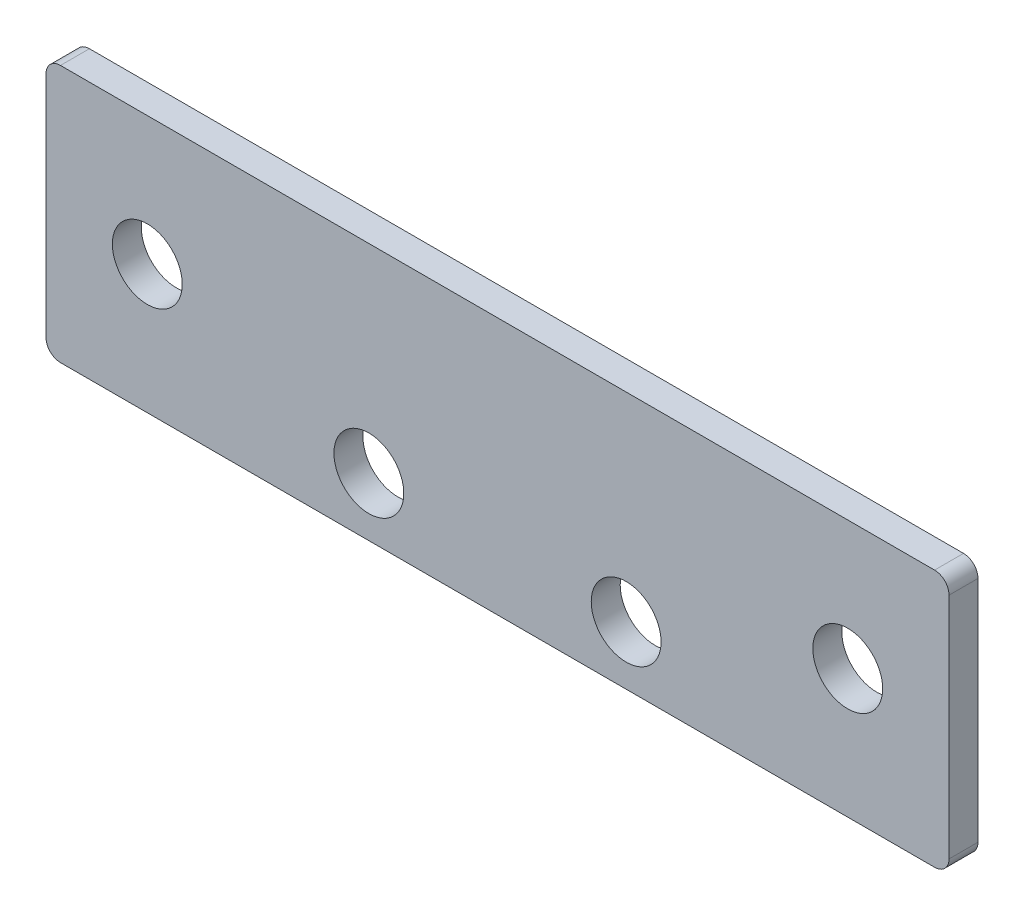
ISO-10303-21;
HEADER;
FILE_DESCRIPTION(('STEP AP214'),'2;1');
FILE_NAME('part.step','',(''),(''),'','','');
FILE_SCHEMA(('AUTOMOTIVE_DESIGN { 1 0 10303 214 1 1 1 1 }'));
ENDSEC;
DATA;
#1=APPLICATION_CONTEXT('core data for automotive mechanical design processes');
#2=APPLICATION_PROTOCOL_DEFINITION('international standard','automotive_design',2000,#1);
#3=PRODUCT_CONTEXT('',#1,'mechanical');
#4=PRODUCT('Part','Part','',(#3));
#5=PRODUCT_RELATED_PRODUCT_CATEGORY('part','',(#4));
#6=PRODUCT_DEFINITION_FORMATION('','',#4);
#7=PRODUCT_DEFINITION_CONTEXT('part definition',#1,'design');
#8=PRODUCT_DEFINITION('design','',#6,#7);
#9=PRODUCT_DEFINITION_SHAPE('','',#8);
#10=(LENGTH_UNIT() NAMED_UNIT(*) SI_UNIT(.MILLI.,.METRE.));
#11=(NAMED_UNIT(*) PLANE_ANGLE_UNIT() SI_UNIT($,.RADIAN.));
#12=(NAMED_UNIT(*) SI_UNIT($,.STERADIAN.) SOLID_ANGLE_UNIT());
#13=UNCERTAINTY_MEASURE_WITH_UNIT(LENGTH_MEASURE(1.E-05),#10,'distance_accuracy_value','');
#14=(GEOMETRIC_REPRESENTATION_CONTEXT(3) GLOBAL_UNCERTAINTY_ASSIGNED_CONTEXT((#13)) GLOBAL_UNIT_ASSIGNED_CONTEXT((#10,
#11,#12)) REPRESENTATION_CONTEXT('',''));
#15=CARTESIAN_POINT('',(0.,0.,0.));
#16=DIRECTION('',(0.,0.,1.));
#17=DIRECTION('',(1.,0.,0.));
#18=AXIS2_PLACEMENT_3D('',#15,#16,#17);
#19=CARTESIAN_POINT('',(-24.56,-7.00000000000001,0.));
#20=DIRECTION('',(0.,0.,1.));
#21=DIRECTION('',(1.,0.,0.));
#22=AXIS2_PLACEMENT_3D('',#19,#20,#21);
#23=PLANE('',#22);
#24=CARTESIAN_POINT('',(-6.9977,-3.82500000000001,0.));
#25=DIRECTION('',(0.,0.,-1.));
#26=DIRECTION('',(-1.,0.,0.));
#27=AXIS2_PLACEMENT_3D('',#24,#25,#26);
#28=CIRCLE('',#27,1.9);
#29=CARTESIAN_POINT('',(-8.8977,-3.82500000000001,0.));
#30=VERTEX_POINT('',#29);
#31=EDGE_CURVE('E143',#30,#30,#28,.F.);
#32=ORIENTED_EDGE('',*,*,#31,.T.);
#33=EDGE_LOOP('',(#32));
#34=FACE_BOUND('',#33,.T.);
#35=CARTESIAN_POINT('',(19.05,0.,0.));
#36=DIRECTION('',(0.,0.,-1.));
#37=DIRECTION('',(-1.,0.,0.));
#38=AXIS2_PLACEMENT_3D('',#35,#36,#37);
#39=CIRCLE('',#38,1.9);
#40=CARTESIAN_POINT('',(17.15,0.,0.));
#41=VERTEX_POINT('',#40);
#42=EDGE_CURVE('E146',#41,#41,#39,.F.);
#43=ORIENTED_EDGE('',*,*,#42,.T.);
#44=EDGE_LOOP('',(#43));
#45=FACE_BOUND('',#44,.T.);
#46=CARTESIAN_POINT('',(23.7726,-6.21259999999999,0.));
#47=DIRECTION('',(0.,0.,-1.));
#48=DIRECTION('',(-1.,0.,0.));
#49=AXIS2_PLACEMENT_3D('',#46,#47,#48);
#50=CIRCLE('',#49,0.787400000000001);
#51=CARTESIAN_POINT('',(23.7726,-6.99999999999999,0.));
#52=VERTEX_POINT('',#51);
#53=CARTESIAN_POINT('',(24.56,-6.21259999999999,0.));
#54=VERTEX_POINT('',#53);
#55=EDGE_CURVE('E86',#52,#54,#50,.F.);
#56=ORIENTED_EDGE('',*,*,#55,.F.);
#57=DIRECTION('',(-1.,0.,0.));
#58=VECTOR('',#57,1.);
#59=CARTESIAN_POINT('',(-24.56,-7.00000000000001,0.));
#60=LINE('',#59,#58);
#61=CARTESIAN_POINT('',(-23.7726,-7.00000000000001,0.));
#62=VERTEX_POINT('',#61);
#63=EDGE_CURVE('E78',#52,#62,#60,.T.);
#64=ORIENTED_EDGE('',*,*,#63,.T.);
#65=CARTESIAN_POINT('',(-23.7726,-6.21260000000001,0.));
#66=DIRECTION('',(0.,0.,-1.));
#67=DIRECTION('',(-1.,0.,0.));
#68=AXIS2_PLACEMENT_3D('',#65,#66,#67);
#69=CIRCLE('',#68,0.787400000000001);
#70=CARTESIAN_POINT('',(-24.56,-6.21260000000001,0.));
#71=VERTEX_POINT('',#70);
#72=EDGE_CURVE('E150',#71,#62,#69,.F.);
#73=ORIENTED_EDGE('',*,*,#72,.F.);
#74=DIRECTION('',(0.,1.,0.));
#75=VECTOR('',#74,1.);
#76=CARTESIAN_POINT('',(-24.56,7.,0.));
#77=LINE('',#76,#75);
#78=CARTESIAN_POINT('',(-24.56,6.2126,0.));
#79=VERTEX_POINT('',#78);
#80=EDGE_CURVE('E113',#71,#79,#77,.T.);
#81=ORIENTED_EDGE('',*,*,#80,.T.);
#82=CARTESIAN_POINT('',(-23.7726,6.2126,0.));
#83=DIRECTION('',(0.,0.,-1.));
#84=DIRECTION('',(-1.,0.,0.));
#85=AXIS2_PLACEMENT_3D('',#82,#83,#84);
#86=CIRCLE('',#85,0.787400000000001);
#87=CARTESIAN_POINT('',(-23.7726,7.,0.));
#88=VERTEX_POINT('',#87);
#89=EDGE_CURVE('E153',#88,#79,#86,.F.);
#90=ORIENTED_EDGE('',*,*,#89,.F.);
#91=DIRECTION('',(1.,0.,0.));
#92=VECTOR('',#91,1.);
#93=CARTESIAN_POINT('',(-24.56,7.,0.));
#94=LINE('',#93,#92);
#95=CARTESIAN_POINT('',(23.7726,7.00000000000001,0.));
#96=VERTEX_POINT('',#95);
#97=EDGE_CURVE('E117',#88,#96,#94,.T.);
#98=ORIENTED_EDGE('',*,*,#97,.T.);
#99=CARTESIAN_POINT('',(23.7726,6.21260000000001,0.));
#100=DIRECTION('',(0.,0.,-1.));
#101=DIRECTION('',(-1.,0.,0.));
#102=AXIS2_PLACEMENT_3D('',#99,#100,#101);
#103=CIRCLE('',#102,0.787400000000001);
#104=CARTESIAN_POINT('',(24.56,6.21260000000001,0.));
#105=VERTEX_POINT('',#104);
#106=EDGE_CURVE('E89',#105,#96,#103,.F.);
#107=ORIENTED_EDGE('',*,*,#106,.F.);
#108=DIRECTION('',(0.,1.,0.));
#109=VECTOR('',#108,1.);
#110=CARTESIAN_POINT('',(24.56,7.00000000000001,0.));
#111=LINE('',#110,#109);
#112=EDGE_CURVE('E83',#105,#54,#111,.F.);
#113=ORIENTED_EDGE('',*,*,#112,.T.);
#114=EDGE_LOOP('',(#56,#64,#73,#81,#90,#98,#107,#113));
#115=FACE_BOUND('',#114,.T.);
#116=CARTESIAN_POINT('',(-19.05,0.,0.));
#117=DIRECTION('',(0.,0.,-1.));
#118=DIRECTION('',(-1.,0.,0.));
#119=AXIS2_PLACEMENT_3D('',#116,#117,#118);
#120=CIRCLE('',#119,1.9);
#121=CARTESIAN_POINT('',(-20.95,0.,0.));
#122=VERTEX_POINT('',#121);
#123=EDGE_CURVE('E112',#122,#122,#120,.F.);
#124=ORIENTED_EDGE('',*,*,#123,.T.);
#125=EDGE_LOOP('',(#124));
#126=FACE_BOUND('',#125,.T.);
#127=CARTESIAN_POINT('',(6.9977,-3.82500000000001,0.));
#128=DIRECTION('',(0.,0.,-1.));
#129=DIRECTION('',(-1.,0.,0.));
#130=AXIS2_PLACEMENT_3D('',#127,#128,#129);
#131=CIRCLE('',#130,1.9);
#132=CARTESIAN_POINT('',(5.0977,-3.82500000000001,0.));
#133=VERTEX_POINT('',#132);
#134=EDGE_CURVE('E20',#133,#133,#131,.F.);
#135=ORIENTED_EDGE('',*,*,#134,.T.);
#136=EDGE_LOOP('',(#135));
#137=FACE_BOUND('',#136,.T.);
#138=ADVANCED_FACE('F17',(#34,#45,#115,#126,#137),#23,.F.);
#139=CARTESIAN_POINT('',(6.9977,-3.82500000000001,1.5748));
#140=DIRECTION('',(0.,0.,-1.));
#141=DIRECTION('',(-1.,0.,0.));
#142=AXIS2_PLACEMENT_3D('',#139,#140,#141);
#143=CYLINDRICAL_SURFACE('',#142,1.9);
#144=CARTESIAN_POINT('',(6.9977,-3.82500000000001,1.5748));
#145=DIRECTION('',(0.,0.,-1.));
#146=DIRECTION('',(-1.,0.,0.));
#147=AXIS2_PLACEMENT_3D('',#144,#145,#146);
#148=CIRCLE('',#147,1.9);
#149=CARTESIAN_POINT('',(5.0977,-3.82500000000001,1.5748));
#150=VERTEX_POINT('',#149);
#151=EDGE_CURVE('E140',#150,#150,#148,.T.);
#152=ORIENTED_EDGE('',*,*,#151,.F.);
#153=EDGE_LOOP('',(#152));
#154=FACE_BOUND('',#153,.T.);
#155=ORIENTED_EDGE('',*,*,#134,.F.);
#156=EDGE_LOOP('',(#155));
#157=FACE_BOUND('',#156,.T.);
#158=ADVANCED_FACE('F161',(#154,#157),#143,.F.);
#159=CARTESIAN_POINT('',(-19.05,0.,1.5748));
#160=DIRECTION('',(0.,0.,-1.));
#161=DIRECTION('',(-1.,0.,0.));
#162=AXIS2_PLACEMENT_3D('',#159,#160,#161);
#163=CYLINDRICAL_SURFACE('',#162,1.9);
#164=CARTESIAN_POINT('',(-19.05,0.,1.5748));
#165=DIRECTION('',(0.,0.,-1.));
#166=DIRECTION('',(-1.,0.,0.));
#167=AXIS2_PLACEMENT_3D('',#164,#165,#166);
#168=CIRCLE('',#167,1.9);
#169=CARTESIAN_POINT('',(-20.95,0.,1.5748));
#170=VERTEX_POINT('',#169);
#171=EDGE_CURVE('E137',#170,#170,#168,.T.);
#172=ORIENTED_EDGE('',*,*,#171,.F.);
#173=EDGE_LOOP('',(#172));
#174=FACE_BOUND('',#173,.T.);
#175=ORIENTED_EDGE('',*,*,#123,.F.);
#176=EDGE_LOOP('',(#175));
#177=FACE_BOUND('',#176,.T.);
#178=ADVANCED_FACE('F163',(#174,#177),#163,.F.);
#179=CARTESIAN_POINT('',(-24.56,-7.00000000000001,1.5748));
#180=DIRECTION('',(0.,1.,0.));
#181=DIRECTION('',(-1.,0.,0.));
#182=AXIS2_PLACEMENT_3D('',#179,#180,#181);
#183=PLANE('',#182);
#184=DIRECTION('',(0.,0.,-1.));
#185=VECTOR('',#184,1.);
#186=CARTESIAN_POINT('',(23.7726,-6.99999999999999,1.5748));
#187=LINE('',#186,#185);
#188=CARTESIAN_POINT('',(23.7726,-7.,1.5748));
#189=VERTEX_POINT('',#188);
#190=EDGE_CURVE('E99',#189,#52,#187,.T.);
#191=ORIENTED_EDGE('',*,*,#190,.F.);
#192=DIRECTION('',(1.,0.,0.));
#193=VECTOR('',#192,1.);
#194=CARTESIAN_POINT('',(-24.56,-7.00000000000001,1.5748));
#195=LINE('',#194,#193);
#196=CARTESIAN_POINT('',(-23.7726,-7.00000000000001,1.5748));
#197=VERTEX_POINT('',#196);
#198=EDGE_CURVE('E136',#197,#189,#195,.T.);
#199=ORIENTED_EDGE('',*,*,#198,.F.);
#200=DIRECTION('',(0.,0.,-1.));
#201=VECTOR('',#200,1.);
#202=CARTESIAN_POINT('',(-23.7726,-7.00000000000001,1.5748));
#203=LINE('',#202,#201);
#204=EDGE_CURVE('E149',#62,#197,#203,.F.);
#205=ORIENTED_EDGE('',*,*,#204,.F.);
#206=ORIENTED_EDGE('',*,*,#63,.F.);
#207=EDGE_LOOP('',(#191,#199,#205,#206));
#208=FACE_BOUND('',#207,.T.);
#209=ADVANCED_FACE('F170',(#208),#183,.F.);
#210=CARTESIAN_POINT('',(23.7726,-6.21259999999999,1.5748));
#211=DIRECTION('',(0.,0.,-1.));
#212=DIRECTION('',(-1.,0.,0.));
#213=AXIS2_PLACEMENT_3D('',#210,#211,#212);
#214=CYLINDRICAL_SURFACE('',#213,0.787400000000001);
#215=ORIENTED_EDGE('',*,*,#55,.T.);
#216=DIRECTION('',(0.,0.,1.));
#217=VECTOR('',#216,1.);
#218=CARTESIAN_POINT('',(24.56,-6.21259999999999,1.5748));
#219=LINE('',#218,#217);
#220=CARTESIAN_POINT('',(24.56,-6.21259999999999,1.5748));
#221=VERTEX_POINT('',#220);
#222=EDGE_CURVE('E93',#54,#221,#219,.T.);
#223=ORIENTED_EDGE('',*,*,#222,.T.);
#224=CARTESIAN_POINT('',(23.7726,-6.21259999999999,1.5748));
#225=DIRECTION('',(0.,0.,-1.));
#226=DIRECTION('',(-1.,0.,0.));
#227=AXIS2_PLACEMENT_3D('',#224,#225,#226);
#228=CIRCLE('',#227,0.787400000000001);
#229=EDGE_CURVE('E134',#189,#221,#228,.F.);
#230=ORIENTED_EDGE('',*,*,#229,.F.);
#231=ORIENTED_EDGE('',*,*,#190,.T.);
#232=EDGE_LOOP('',(#215,#223,#230,#231));
#233=FACE_BOUND('',#232,.T.);
#234=ADVANCED_FACE('F96',(#233),#214,.T.);
#235=CARTESIAN_POINT('',(24.56,7.00000000000001,1.5748));
#236=DIRECTION('',(-1.,0.,0.));
#237=DIRECTION('',(0.,0.,1.));
#238=AXIS2_PLACEMENT_3D('',#235,#236,#237);
#239=PLANE('',#238);
#240=ORIENTED_EDGE('',*,*,#222,.F.);
#241=ORIENTED_EDGE('',*,*,#112,.F.);
#242=DIRECTION('',(0.,0.,-1.));
#243=VECTOR('',#242,1.);
#244=CARTESIAN_POINT('',(24.56,6.21260000000001,1.5748));
#245=LINE('',#244,#243);
#246=CARTESIAN_POINT('',(24.56,6.21260000000001,1.5748));
#247=VERTEX_POINT('',#246);
#248=EDGE_CURVE('E105',#247,#105,#245,.T.);
#249=ORIENTED_EDGE('',*,*,#248,.F.);
#250=DIRECTION('',(0.,1.,0.));
#251=VECTOR('',#250,1.);
#252=CARTESIAN_POINT('',(24.56,-7.00000000000001,1.5748));
#253=LINE('',#252,#251);
#254=EDGE_CURVE('E103',#221,#247,#253,.T.);
#255=ORIENTED_EDGE('',*,*,#254,.F.);
#256=EDGE_LOOP('',(#240,#241,#249,#255));
#257=FACE_BOUND('',#256,.T.);
#258=ADVANCED_FACE('F101',(#257),#239,.F.);
#259=CARTESIAN_POINT('',(23.7726,6.21260000000001,1.5748));
#260=DIRECTION('',(0.,0.,-1.));
#261=DIRECTION('',(-1.,0.,0.));
#262=AXIS2_PLACEMENT_3D('',#259,#260,#261);
#263=CYLINDRICAL_SURFACE('',#262,0.787400000000001);
#264=ORIENTED_EDGE('',*,*,#106,.T.);
#265=DIRECTION('',(0.,0.,1.));
#266=VECTOR('',#265,1.);
#267=CARTESIAN_POINT('',(23.7726,7.00000000000001,1.5748));
#268=LINE('',#267,#266);
#269=CARTESIAN_POINT('',(23.7726,7.00000000000001,1.5748));
#270=VERTEX_POINT('',#269);
#271=EDGE_CURVE('E119',#96,#270,#268,.T.);
#272=ORIENTED_EDGE('',*,*,#271,.T.);
#273=CARTESIAN_POINT('',(23.7726,6.21260000000001,1.5748));
#274=DIRECTION('',(0.,0.,-1.));
#275=DIRECTION('',(-1.,0.,0.));
#276=AXIS2_PLACEMENT_3D('',#273,#274,#275);
#277=CIRCLE('',#276,0.787400000000001);
#278=EDGE_CURVE('E131',#247,#270,#277,.F.);
#279=ORIENTED_EDGE('',*,*,#278,.F.);
#280=ORIENTED_EDGE('',*,*,#248,.T.);
#281=EDGE_LOOP('',(#264,#272,#279,#280));
#282=FACE_BOUND('',#281,.T.);
#283=ADVANCED_FACE('F205',(#282),#263,.T.);
#284=CARTESIAN_POINT('',(-24.56,7.,1.5748));
#285=DIRECTION('',(0.,-1.,0.));
#286=DIRECTION('',(1.,0.,0.));
#287=AXIS2_PLACEMENT_3D('',#284,#285,#286);
#288=PLANE('',#287);
#289=DIRECTION('',(0.,0.,-1.));
#290=VECTOR('',#289,1.);
#291=CARTESIAN_POINT('',(-23.7726,7.,1.5748));
#292=LINE('',#291,#290);
#293=CARTESIAN_POINT('',(-23.7726,7.00000000000001,1.5748));
#294=VERTEX_POINT('',#293);
#295=EDGE_CURVE('E118',#294,#88,#292,.T.);
#296=ORIENTED_EDGE('',*,*,#295,.F.);
#297=DIRECTION('',(1.,0.,0.));
#298=VECTOR('',#297,1.);
#299=CARTESIAN_POINT('',(-24.56,7.00000000000001,1.5748));
#300=LINE('',#299,#298);
#301=EDGE_CURVE('E130',#270,#294,#300,.F.);
#302=ORIENTED_EDGE('',*,*,#301,.F.);
#303=ORIENTED_EDGE('',*,*,#271,.F.);
#304=ORIENTED_EDGE('',*,*,#97,.F.);
#305=EDGE_LOOP('',(#296,#302,#303,#304));
#306=FACE_BOUND('',#305,.T.);
#307=ADVANCED_FACE('F201',(#306),#288,.F.);
#308=CARTESIAN_POINT('',(-23.7726,6.2126,1.5748));
#309=DIRECTION('',(0.,0.,-1.));
#310=DIRECTION('',(-1.,0.,0.));
#311=AXIS2_PLACEMENT_3D('',#308,#309,#310);
#312=CYLINDRICAL_SURFACE('',#311,0.787400000000001);
#313=ORIENTED_EDGE('',*,*,#89,.T.);
#314=DIRECTION('',(0.,0.,1.));
#315=VECTOR('',#314,1.);
#316=CARTESIAN_POINT('',(-24.56,6.2126,1.5748));
#317=LINE('',#316,#315);
#318=CARTESIAN_POINT('',(-24.56,6.2126,1.5748));
#319=VERTEX_POINT('',#318);
#320=EDGE_CURVE('E116',#79,#319,#317,.T.);
#321=ORIENTED_EDGE('',*,*,#320,.T.);
#322=CARTESIAN_POINT('',(-23.7726,6.2126,1.5748));
#323=DIRECTION('',(0.,0.,-1.));
#324=DIRECTION('',(-1.,0.,0.));
#325=AXIS2_PLACEMENT_3D('',#322,#323,#324);
#326=CIRCLE('',#325,0.787400000000001);
#327=EDGE_CURVE('E127',#294,#319,#326,.F.);
#328=ORIENTED_EDGE('',*,*,#327,.F.);
#329=ORIENTED_EDGE('',*,*,#295,.T.);
#330=EDGE_LOOP('',(#313,#321,#328,#329));
#331=FACE_BOUND('',#330,.T.);
#332=ADVANCED_FACE('F198',(#331),#312,.T.);
#333=CARTESIAN_POINT('',(-24.56,7.,1.5748));
#334=DIRECTION('',(1.,0.,0.));
#335=DIRECTION('',(0.,1.,0.));
#336=AXIS2_PLACEMENT_3D('',#333,#334,#335);
#337=PLANE('',#336);
#338=DIRECTION('',(0.,0.,-1.));
#339=VECTOR('',#338,1.);
#340=CARTESIAN_POINT('',(-24.56,-6.21260000000001,1.5748));
#341=LINE('',#340,#339);
#342=CARTESIAN_POINT('',(-24.56,-6.21260000000001,1.5748));
#343=VERTEX_POINT('',#342);
#344=EDGE_CURVE('E35',#343,#71,#341,.T.);
#345=ORIENTED_EDGE('',*,*,#344,.F.);
#346=DIRECTION('',(0.,1.,0.));
#347=VECTOR('',#346,1.);
#348=CARTESIAN_POINT('',(-24.56,-7.00000000000001,1.5748));
#349=LINE('',#348,#347);
#350=EDGE_CURVE('E126',#319,#343,#349,.F.);
#351=ORIENTED_EDGE('',*,*,#350,.F.);
#352=ORIENTED_EDGE('',*,*,#320,.F.);
#353=ORIENTED_EDGE('',*,*,#80,.F.);
#354=EDGE_LOOP('',(#345,#351,#352,#353));
#355=FACE_BOUND('',#354,.T.);
#356=ADVANCED_FACE('F194',(#355),#337,.F.);
#357=CARTESIAN_POINT('',(-23.7726,-6.21260000000001,1.5748));
#358=DIRECTION('',(0.,0.,-1.));
#359=DIRECTION('',(-1.,0.,0.));
#360=AXIS2_PLACEMENT_3D('',#357,#358,#359);
#361=CYLINDRICAL_SURFACE('',#360,0.787400000000001);
#362=ORIENTED_EDGE('',*,*,#72,.T.);
#363=ORIENTED_EDGE('',*,*,#204,.T.);
#364=CARTESIAN_POINT('',(-23.7726,-6.21260000000001,1.5748));
#365=DIRECTION('',(0.,0.,-1.));
#366=DIRECTION('',(-1.,0.,0.));
#367=AXIS2_PLACEMENT_3D('',#364,#365,#366);
#368=CIRCLE('',#367,0.787400000000001);
#369=EDGE_CURVE('E123',#343,#197,#368,.F.);
#370=ORIENTED_EDGE('',*,*,#369,.F.);
#371=ORIENTED_EDGE('',*,*,#344,.T.);
#372=EDGE_LOOP('',(#362,#363,#370,#371));
#373=FACE_BOUND('',#372,.T.);
#374=ADVANCED_FACE('F190',(#373),#361,.T.);
#375=CARTESIAN_POINT('',(19.05,0.,1.5748));
#376=DIRECTION('',(0.,0.,-1.));
#377=DIRECTION('',(-1.,0.,0.));
#378=AXIS2_PLACEMENT_3D('',#375,#376,#377);
#379=CYLINDRICAL_SURFACE('',#378,1.9);
#380=CARTESIAN_POINT('',(19.05,0.,1.5748));
#381=DIRECTION('',(0.,0.,-1.));
#382=DIRECTION('',(-1.,0.,0.));
#383=AXIS2_PLACEMENT_3D('',#380,#381,#382);
#384=CIRCLE('',#383,1.9);
#385=CARTESIAN_POINT('',(17.15,0.,1.5748));
#386=VERTEX_POINT('',#385);
#387=EDGE_CURVE('E26',#386,#386,#384,.T.);
#388=ORIENTED_EDGE('',*,*,#387,.F.);
#389=EDGE_LOOP('',(#388));
#390=FACE_BOUND('',#389,.T.);
#391=ORIENTED_EDGE('',*,*,#42,.F.);
#392=EDGE_LOOP('',(#391));
#393=FACE_BOUND('',#392,.T.);
#394=ADVANCED_FACE('F183',(#390,#393),#379,.F.);
#395=CARTESIAN_POINT('',(-6.9977,-3.82500000000001,1.5748));
#396=DIRECTION('',(0.,0.,-1.));
#397=DIRECTION('',(-1.,0.,0.));
#398=AXIS2_PLACEMENT_3D('',#395,#396,#397);
#399=CYLINDRICAL_SURFACE('',#398,1.9);
#400=CARTESIAN_POINT('',(-6.9977,-3.82500000000001,1.5748));
#401=DIRECTION('',(0.,0.,-1.));
#402=DIRECTION('',(-1.,0.,0.));
#403=AXIS2_PLACEMENT_3D('',#400,#401,#402);
#404=CIRCLE('',#403,1.9);
#405=CARTESIAN_POINT('',(-8.8977,-3.82500000000001,1.5748));
#406=VERTEX_POINT('',#405);
#407=EDGE_CURVE('E11',#406,#406,#404,.T.);
#408=ORIENTED_EDGE('',*,*,#407,.F.);
#409=EDGE_LOOP('',(#408));
#410=FACE_BOUND('',#409,.T.);
#411=ORIENTED_EDGE('',*,*,#31,.F.);
#412=EDGE_LOOP('',(#411));
#413=FACE_BOUND('',#412,.T.);
#414=ADVANCED_FACE('F177',(#410,#413),#399,.F.);
#415=CARTESIAN_POINT('',(-24.56,-7.00000000000001,1.5748));
#416=DIRECTION('',(0.,0.,1.));
#417=DIRECTION('',(1.,0.,0.));
#418=AXIS2_PLACEMENT_3D('',#415,#416,#417);
#419=PLANE('',#418);
#420=ORIENTED_EDGE('',*,*,#407,.T.);
#421=EDGE_LOOP('',(#420));
#422=FACE_BOUND('',#421,.T.);
#423=ORIENTED_EDGE('',*,*,#387,.T.);
#424=EDGE_LOOP('',(#423));
#425=FACE_BOUND('',#424,.T.);
#426=ORIENTED_EDGE('',*,*,#350,.T.);
#427=ORIENTED_EDGE('',*,*,#369,.T.);
#428=ORIENTED_EDGE('',*,*,#198,.T.);
#429=ORIENTED_EDGE('',*,*,#229,.T.);
#430=ORIENTED_EDGE('',*,*,#254,.T.);
#431=ORIENTED_EDGE('',*,*,#278,.T.);
#432=ORIENTED_EDGE('',*,*,#301,.T.);
#433=ORIENTED_EDGE('',*,*,#327,.T.);
#434=EDGE_LOOP('',(#426,#427,#428,#429,#430,#431,#432,#433));
#435=FACE_BOUND('',#434,.T.);
#436=ORIENTED_EDGE('',*,*,#171,.T.);
#437=EDGE_LOOP('',(#436));
#438=FACE_BOUND('',#437,.T.);
#439=ORIENTED_EDGE('',*,*,#151,.T.);
#440=EDGE_LOOP('',(#439));
#441=FACE_BOUND('',#440,.T.);
#442=ADVANCED_FACE('F175',(#422,#425,#435,#438,#441),#419,.T.);
#443=CLOSED_SHELL('',(#138,#158,#178,#209,#234,#258,#283,#307,#332,#356,#374,#394,#414,#442));
#444=MANIFOLD_SOLID_BREP('B1',#443);
#445=ADVANCED_BREP_SHAPE_REPRESENTATION('',(#18,#444),#14);
#446=SHAPE_DEFINITION_REPRESENTATION(#9,#445);
ENDSEC;
END-ISO-10303-21;
